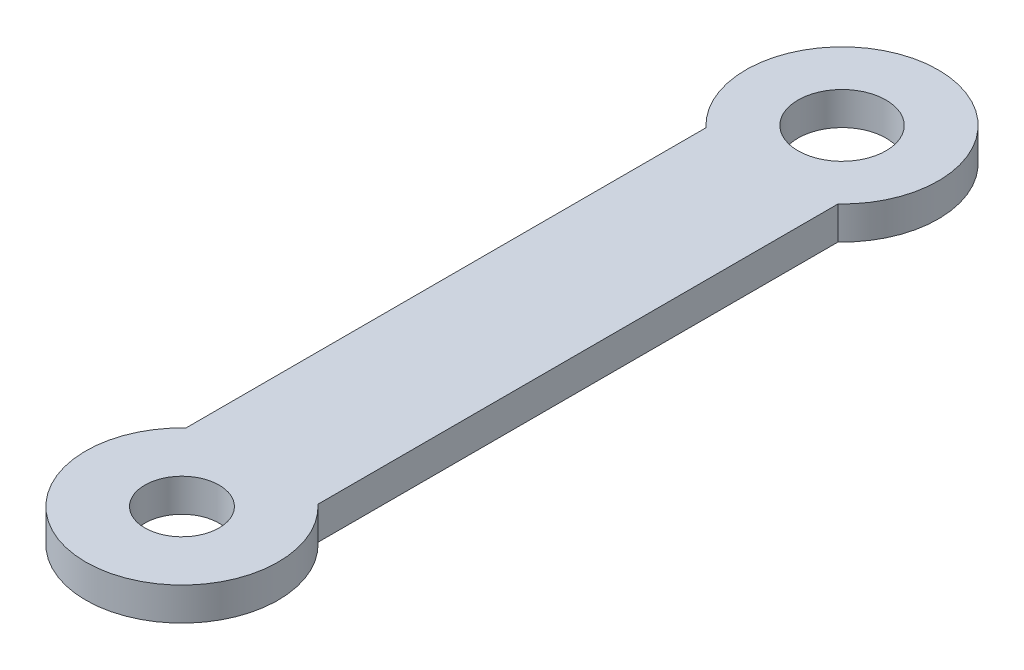
ISO-10303-21;
HEADER;
FILE_DESCRIPTION(('STEP AP214'),'2;1');
FILE_NAME('part.step','',(''),(''),'','','');
FILE_SCHEMA(('AUTOMOTIVE_DESIGN { 1 0 10303 214 1 1 1 1 }'));
ENDSEC;
DATA;
#1=APPLICATION_CONTEXT('core data for automotive mechanical design processes');
#2=APPLICATION_PROTOCOL_DEFINITION('international standard','automotive_design',2000,#1);
#3=PRODUCT_CONTEXT('',#1,'mechanical');
#4=PRODUCT('Part','Part','',(#3));
#5=PRODUCT_RELATED_PRODUCT_CATEGORY('part','',(#4));
#6=PRODUCT_DEFINITION_FORMATION('','',#4);
#7=PRODUCT_DEFINITION_CONTEXT('part definition',#1,'design');
#8=PRODUCT_DEFINITION('design','',#6,#7);
#9=PRODUCT_DEFINITION_SHAPE('','',#8);
#10=(LENGTH_UNIT() NAMED_UNIT(*) SI_UNIT(.MILLI.,.METRE.));
#11=(NAMED_UNIT(*) PLANE_ANGLE_UNIT() SI_UNIT($,.RADIAN.));
#12=(NAMED_UNIT(*) SI_UNIT($,.STERADIAN.) SOLID_ANGLE_UNIT());
#13=UNCERTAINTY_MEASURE_WITH_UNIT(LENGTH_MEASURE(1.E-05),#10,'distance_accuracy_value','');
#14=(GEOMETRIC_REPRESENTATION_CONTEXT(3) GLOBAL_UNCERTAINTY_ASSIGNED_CONTEXT((#13)) GLOBAL_UNIT_ASSIGNED_CONTEXT((#10,
#11,#12)) REPRESENTATION_CONTEXT('',''));
#15=CARTESIAN_POINT('',(0.,0.,0.));
#16=DIRECTION('',(0.,0.,1.));
#17=DIRECTION('',(1.,0.,0.));
#18=AXIS2_PLACEMENT_3D('',#15,#16,#17);
#19=CARTESIAN_POINT('',(0.,3.,0.));
#20=DIRECTION('',(0.,1.,0.));
#21=DIRECTION('',(0.,0.,1.));
#22=AXIS2_PLACEMENT_3D('',#19,#20,#21);
#23=PLANE('',#22);
#24=CARTESIAN_POINT('',(0.,3.,-60.));
#25=DIRECTION('',(0.,1.,0.));
#26=DIRECTION('',(0.,0.,1.));
#27=AXIS2_PLACEMENT_3D('',#24,#25,#26);
#28=CIRCLE('',#27,4.);
#29=CARTESIAN_POINT('',(0.,3.,-56.));
#30=VERTEX_POINT('',#29);
#31=EDGE_CURVE('E99',#30,#30,#28,.T.);
#32=ORIENTED_EDGE('',*,*,#31,.F.);
#33=EDGE_LOOP('',(#32));
#34=FACE_BOUND('',#33,.T.);
#35=DIRECTION('',(0.,0.,1.));
#36=VECTOR('',#35,1.);
#37=CARTESIAN_POINT('',(-6.,3.,-30.));
#38=LINE('',#37,#36);
#39=CARTESIAN_POINT('',(-6.,3.,-53.6311303985715));
#40=VERTEX_POINT('',#39);
#41=CARTESIAN_POINT('',(-6.,3.,-6.3688696014285));
#42=VERTEX_POINT('',#41);
#43=EDGE_CURVE('E50',#40,#42,#38,.T.);
#44=ORIENTED_EDGE('',*,*,#43,.T.);
#45=CARTESIAN_POINT('',(0.,3.,0.));
#46=DIRECTION('',(0.,1.,0.));
#47=DIRECTION('',(0.,0.,1.));
#48=AXIS2_PLACEMENT_3D('',#45,#46,#47);
#49=CIRCLE('',#48,8.75);
#50=CARTESIAN_POINT('',(6.,3.,-6.3688696014285));
#51=VERTEX_POINT('',#50);
#52=EDGE_CURVE('E80',#42,#51,#49,.T.);
#53=ORIENTED_EDGE('',*,*,#52,.T.);
#54=DIRECTION('',(0.,0.,-1.));
#55=VECTOR('',#54,1.);
#56=CARTESIAN_POINT('',(6.,3.,-30.));
#57=LINE('',#56,#55);
#58=CARTESIAN_POINT('',(6.,3.,-53.6311303985715));
#59=VERTEX_POINT('',#58);
#60=EDGE_CURVE('E84',#51,#59,#57,.T.);
#61=ORIENTED_EDGE('',*,*,#60,.T.);
#62=CARTESIAN_POINT('',(0.,3.,-60.));
#63=DIRECTION('',(0.,1.,0.));
#64=DIRECTION('',(0.,0.,1.));
#65=AXIS2_PLACEMENT_3D('',#62,#63,#64);
#66=CIRCLE('',#65,8.75);
#67=EDGE_CURVE('E92',#59,#40,#66,.T.);
#68=ORIENTED_EDGE('',*,*,#67,.T.);
#69=EDGE_LOOP('',(#44,#53,#61,#68));
#70=FACE_BOUND('',#69,.T.);
#71=CARTESIAN_POINT('',(0.,3.,0.));
#72=DIRECTION('',(0.,1.,0.));
#73=DIRECTION('',(0.,0.,1.));
#74=AXIS2_PLACEMENT_3D('',#71,#72,#73);
#75=CIRCLE('',#74,3.375);
#76=CARTESIAN_POINT('',(0.,3.,3.375));
#77=VERTEX_POINT('',#76);
#78=EDGE_CURVE('E138',#77,#77,#75,.T.);
#79=ORIENTED_EDGE('',*,*,#78,.F.);
#80=EDGE_LOOP('',(#79));
#81=FACE_BOUND('',#80,.T.);
#82=ADVANCED_FACE('F33',(#34,#70,#81),#23,.T.);
#83=CARTESIAN_POINT('',(0.,0.,0.));
#84=DIRECTION('',(0.,1.,0.));
#85=DIRECTION('',(0.,0.,1.));
#86=AXIS2_PLACEMENT_3D('',#83,#84,#85);
#87=PLANE('',#86);
#88=CARTESIAN_POINT('',(0.,0.,0.));
#89=DIRECTION('',(0.,1.,0.));
#90=DIRECTION('',(0.,0.,1.));
#91=AXIS2_PLACEMENT_3D('',#88,#89,#90);
#92=CIRCLE('',#91,8.75);
#93=CARTESIAN_POINT('',(-6.,0.,-6.3688696014285));
#94=VERTEX_POINT('',#93);
#95=CARTESIAN_POINT('',(6.,0.,-6.3688696014285));
#96=VERTEX_POINT('',#95);
#97=EDGE_CURVE('E88',#94,#96,#92,.T.);
#98=ORIENTED_EDGE('',*,*,#97,.F.);
#99=DIRECTION('',(0.,0.,1.));
#100=VECTOR('',#99,1.);
#101=CARTESIAN_POINT('',(-6.,0.,-30.));
#102=LINE('',#101,#100);
#103=CARTESIAN_POINT('',(-6.,0.,-53.6311303985715));
#104=VERTEX_POINT('',#103);
#105=EDGE_CURVE('E102',#104,#94,#102,.T.);
#106=ORIENTED_EDGE('',*,*,#105,.F.);
#107=CARTESIAN_POINT('',(0.,0.,-60.));
#108=DIRECTION('',(0.,1.,0.));
#109=DIRECTION('',(0.,0.,1.));
#110=AXIS2_PLACEMENT_3D('',#107,#108,#109);
#111=CIRCLE('',#110,8.75);
#112=CARTESIAN_POINT('',(6.,0.,-53.6311303985715));
#113=VERTEX_POINT('',#112);
#114=EDGE_CURVE('E74',#113,#104,#111,.T.);
#115=ORIENTED_EDGE('',*,*,#114,.F.);
#116=DIRECTION('',(0.,0.,-1.));
#117=VECTOR('',#116,1.);
#118=CARTESIAN_POINT('',(6.,0.,-30.));
#119=LINE('',#118,#117);
#120=EDGE_CURVE('E67',#96,#113,#119,.T.);
#121=ORIENTED_EDGE('',*,*,#120,.F.);
#122=EDGE_LOOP('',(#98,#106,#115,#121));
#123=FACE_BOUND('',#122,.T.);
#124=CARTESIAN_POINT('',(0.,0.,-60.));
#125=DIRECTION('',(0.,1.,0.));
#126=DIRECTION('',(0.,0.,1.));
#127=AXIS2_PLACEMENT_3D('',#124,#125,#126);
#128=CIRCLE('',#127,4.);
#129=CARTESIAN_POINT('',(0.,0.,-56.));
#130=VERTEX_POINT('',#129);
#131=EDGE_CURVE('E144',#130,#130,#128,.T.);
#132=ORIENTED_EDGE('',*,*,#131,.T.);
#133=EDGE_LOOP('',(#132));
#134=FACE_BOUND('',#133,.T.);
#135=CARTESIAN_POINT('',(0.,0.,0.));
#136=DIRECTION('',(0.,1.,0.));
#137=DIRECTION('',(0.,0.,1.));
#138=AXIS2_PLACEMENT_3D('',#135,#136,#137);
#139=CIRCLE('',#138,3.375);
#140=CARTESIAN_POINT('',(0.,0.,3.375));
#141=VERTEX_POINT('',#140);
#142=EDGE_CURVE('E141',#141,#141,#139,.T.);
#143=ORIENTED_EDGE('',*,*,#142,.T.);
#144=EDGE_LOOP('',(#143));
#145=FACE_BOUND('',#144,.T.);
#146=ADVANCED_FACE('F108',(#123,#134,#145),#87,.F.);
#147=CARTESIAN_POINT('',(0.,3.,0.));
#148=DIRECTION('',(0.,-1.,0.));
#149=DIRECTION('',(0.,0.,-1.));
#150=AXIS2_PLACEMENT_3D('',#147,#148,#149);
#151=CYLINDRICAL_SURFACE('',#150,8.75);
#152=ORIENTED_EDGE('',*,*,#97,.T.);
#153=DIRECTION('',(0.,-1.,0.));
#154=VECTOR('',#153,1.);
#155=CARTESIAN_POINT('',(6.,3.,-6.3688696014285));
#156=LINE('',#155,#154);
#157=EDGE_CURVE('E42',#51,#96,#156,.T.);
#158=ORIENTED_EDGE('',*,*,#157,.F.);
#159=ORIENTED_EDGE('',*,*,#52,.F.);
#160=DIRECTION('',(0.,-1.,0.));
#161=VECTOR('',#160,1.);
#162=CARTESIAN_POINT('',(-6.,3.,-6.3688696014285));
#163=LINE('',#162,#161);
#164=EDGE_CURVE('E11',#42,#94,#163,.T.);
#165=ORIENTED_EDGE('',*,*,#164,.T.);
#166=EDGE_LOOP('',(#152,#158,#159,#165));
#167=FACE_BOUND('',#166,.T.);
#168=ADVANCED_FACE('F35',(#167),#151,.T.);
#169=CARTESIAN_POINT('',(6.,3.,-30.));
#170=DIRECTION('',(-1.,0.,0.));
#171=DIRECTION('',(0.,0.,1.));
#172=AXIS2_PLACEMENT_3D('',#169,#170,#171);
#173=PLANE('',#172);
#174=ORIENTED_EDGE('',*,*,#120,.T.);
#175=DIRECTION('',(0.,-1.,0.));
#176=VECTOR('',#175,1.);
#177=CARTESIAN_POINT('',(6.,3.,-53.6311303985715));
#178=LINE('',#177,#176);
#179=EDGE_CURVE('E89',#59,#113,#178,.T.);
#180=ORIENTED_EDGE('',*,*,#179,.F.);
#181=ORIENTED_EDGE('',*,*,#60,.F.);
#182=ORIENTED_EDGE('',*,*,#157,.T.);
#183=EDGE_LOOP('',(#174,#180,#181,#182));
#184=FACE_BOUND('',#183,.T.);
#185=ADVANCED_FACE('F90',(#184),#173,.F.);
#186=CARTESIAN_POINT('',(0.,3.,-60.));
#187=DIRECTION('',(0.,-1.,0.));
#188=DIRECTION('',(0.,0.,-1.));
#189=AXIS2_PLACEMENT_3D('',#186,#187,#188);
#190=CYLINDRICAL_SURFACE('',#189,8.75);
#191=ORIENTED_EDGE('',*,*,#114,.T.);
#192=DIRECTION('',(0.,-1.,0.));
#193=VECTOR('',#192,1.);
#194=CARTESIAN_POINT('',(-6.,3.,-53.6311303985715));
#195=LINE('',#194,#193);
#196=EDGE_CURVE('E94',#40,#104,#195,.T.);
#197=ORIENTED_EDGE('',*,*,#196,.F.);
#198=ORIENTED_EDGE('',*,*,#67,.F.);
#199=ORIENTED_EDGE('',*,*,#179,.T.);
#200=EDGE_LOOP('',(#191,#197,#198,#199));
#201=FACE_BOUND('',#200,.T.);
#202=ADVANCED_FACE('F105',(#201),#190,.T.);
#203=CARTESIAN_POINT('',(-6.,3.,-30.));
#204=DIRECTION('',(1.,0.,0.));
#205=DIRECTION('',(0.,0.,-1.));
#206=AXIS2_PLACEMENT_3D('',#203,#204,#205);
#207=PLANE('',#206);
#208=ORIENTED_EDGE('',*,*,#105,.T.);
#209=ORIENTED_EDGE('',*,*,#164,.F.);
#210=ORIENTED_EDGE('',*,*,#43,.F.);
#211=ORIENTED_EDGE('',*,*,#196,.T.);
#212=EDGE_LOOP('',(#208,#209,#210,#211));
#213=FACE_BOUND('',#212,.T.);
#214=ADVANCED_FACE('F110',(#213),#207,.F.);
#215=CARTESIAN_POINT('',(0.,3.,-60.));
#216=DIRECTION('',(0.,-1.,0.));
#217=DIRECTION('',(0.,0.,-1.));
#218=AXIS2_PLACEMENT_3D('',#215,#216,#217);
#219=CYLINDRICAL_SURFACE('',#218,4.);
#220=ORIENTED_EDGE('',*,*,#31,.T.);
#221=EDGE_LOOP('',(#220));
#222=FACE_BOUND('',#221,.T.);
#223=ORIENTED_EDGE('',*,*,#131,.F.);
#224=EDGE_LOOP('',(#223));
#225=FACE_BOUND('',#224,.T.);
#226=ADVANCED_FACE('F112',(#222,#225),#219,.F.);
#227=CARTESIAN_POINT('',(0.,3.,0.));
#228=DIRECTION('',(0.,-1.,0.));
#229=DIRECTION('',(0.,0.,-1.));
#230=AXIS2_PLACEMENT_3D('',#227,#228,#229);
#231=CYLINDRICAL_SURFACE('',#230,3.375);
#232=ORIENTED_EDGE('',*,*,#78,.T.);
#233=EDGE_LOOP('',(#232));
#234=FACE_BOUND('',#233,.T.);
#235=ORIENTED_EDGE('',*,*,#142,.F.);
#236=EDGE_LOOP('',(#235));
#237=FACE_BOUND('',#236,.T.);
#238=ADVANCED_FACE('F118',(#234,#237),#231,.F.);
#239=CLOSED_SHELL('',(#82,#146,#168,#185,#202,#214,#226,#238));
#240=MANIFOLD_SOLID_BREP('B2',#239);
#241=ADVANCED_BREP_SHAPE_REPRESENTATION('',(#18,#240),#14);
#242=SHAPE_DEFINITION_REPRESENTATION(#9,#241);
ENDSEC;
END-ISO-10303-21;
